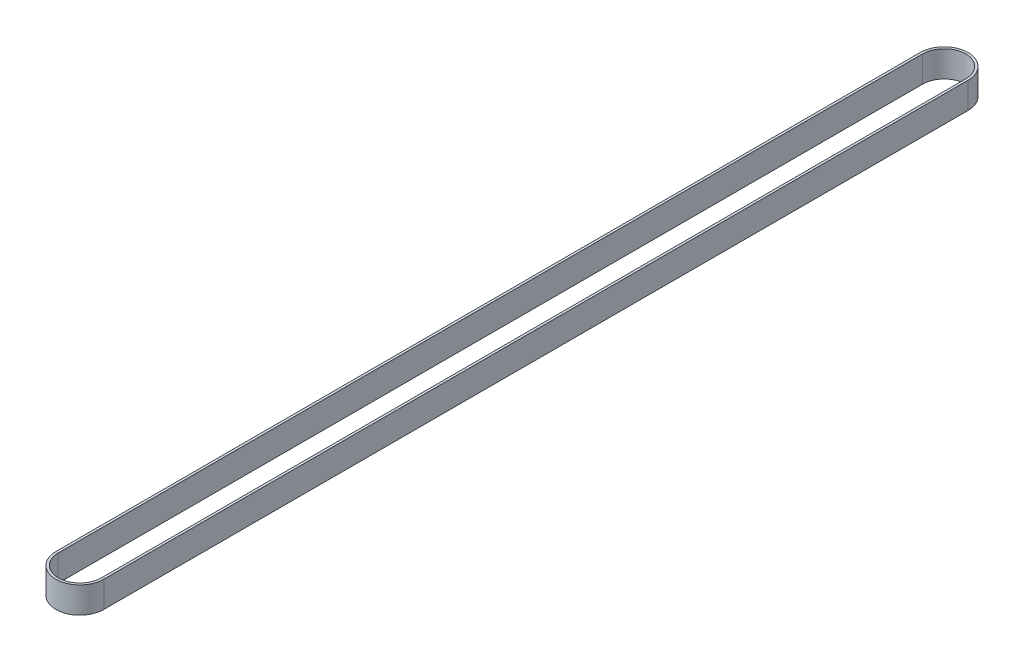
ISO-10303-21;
HEADER;
FILE_DESCRIPTION(('STEP AP214'),'2;1');
FILE_NAME('part.step','',(''),(''),'','','');
FILE_SCHEMA(('AUTOMOTIVE_DESIGN { 1 0 10303 214 1 1 1 1 }'));
ENDSEC;
DATA;
#1=APPLICATION_CONTEXT('core data for automotive mechanical design processes');
#2=APPLICATION_PROTOCOL_DEFINITION('international standard','automotive_design',2000,#1);
#3=PRODUCT_CONTEXT('',#1,'mechanical');
#4=PRODUCT('Part','Part','',(#3));
#5=PRODUCT_RELATED_PRODUCT_CATEGORY('part','',(#4));
#6=PRODUCT_DEFINITION_FORMATION('','',#4);
#7=PRODUCT_DEFINITION_CONTEXT('part definition',#1,'design');
#8=PRODUCT_DEFINITION('design','',#6,#7);
#9=PRODUCT_DEFINITION_SHAPE('','',#8);
#10=(LENGTH_UNIT() NAMED_UNIT(*) SI_UNIT(.MILLI.,.METRE.));
#11=(NAMED_UNIT(*) PLANE_ANGLE_UNIT() SI_UNIT($,.RADIAN.));
#12=(NAMED_UNIT(*) SI_UNIT($,.STERADIAN.) SOLID_ANGLE_UNIT());
#13=UNCERTAINTY_MEASURE_WITH_UNIT(LENGTH_MEASURE(1.E-05),#10,'distance_accuracy_value','');
#14=(GEOMETRIC_REPRESENTATION_CONTEXT(3) GLOBAL_UNCERTAINTY_ASSIGNED_CONTEXT((#13)) GLOBAL_UNIT_ASSIGNED_CONTEXT((#10,
#11,#12)) REPRESENTATION_CONTEXT('',''));
#15=CARTESIAN_POINT('',(0.,0.,0.));
#16=DIRECTION('',(0.,0.,1.));
#17=DIRECTION('',(1.,0.,0.));
#18=AXIS2_PLACEMENT_3D('',#15,#16,#17);
#19=CARTESIAN_POINT('',(0.,11.,0.));
#20=DIRECTION('',(0.,1.,0.));
#21=DIRECTION('',(0.,0.,1.));
#22=AXIS2_PLACEMENT_3D('',#19,#20,#21);
#23=PLANE('',#22);
#24=CARTESIAN_POINT('',(0.,11.,0.));
#25=DIRECTION('',(0.,1.,0.));
#26=DIRECTION('',(0.,0.,1.));
#27=AXIS2_PLACEMENT_3D('',#24,#25,#26);
#28=CIRCLE('',#27,10.05);
#29=CARTESIAN_POINT('',(10.0499999999966,11.,0.));
#30=VERTEX_POINT('',#29);
#31=CARTESIAN_POINT('',(-10.0500000000034,11.,0.));
#32=VERTEX_POINT('',#31);
#33=EDGE_CURVE('E133',#30,#32,#28,.T.);
#34=ORIENTED_EDGE('',*,*,#33,.T.);
#35=DIRECTION('',(0.,0.,1.));
#36=VECTOR('',#35,1.);
#37=CARTESIAN_POINT('',(-10.0500000000034,11.,0.));
#38=LINE('',#37,#36);
#39=CARTESIAN_POINT('',(-10.0500000000034,11.,362.5));
#40=VERTEX_POINT('',#39);
#41=EDGE_CURVE('E136',#32,#40,#38,.T.);
#42=ORIENTED_EDGE('',*,*,#41,.T.);
#43=CARTESIAN_POINT('',(-3.38444550163075E-12,11.,362.5));
#44=DIRECTION('',(0.,1.,0.));
#45=DIRECTION('',(0.,0.,1.));
#46=AXIS2_PLACEMENT_3D('',#43,#44,#45);
#47=CIRCLE('',#46,10.05);
#48=CARTESIAN_POINT('',(10.0499999999966,11.,362.5));
#49=VERTEX_POINT('',#48);
#50=EDGE_CURVE('E139',#40,#49,#47,.T.);
#51=ORIENTED_EDGE('',*,*,#50,.T.);
#52=DIRECTION('',(0.,0.,-1.));
#53=VECTOR('',#52,1.);
#54=CARTESIAN_POINT('',(10.0499999999966,11.,362.5));
#55=LINE('',#54,#53);
#56=EDGE_CURVE('E141',#49,#30,#55,.T.);
#57=ORIENTED_EDGE('',*,*,#56,.T.);
#58=EDGE_LOOP('',(#34,#42,#51,#57));
#59=FACE_BOUND('',#58,.T.);
#60=DIRECTION('',(0.,0.,1.));
#61=VECTOR('',#60,1.);
#62=CARTESIAN_POINT('',(-9.05000000000339,11.,0.));
#63=LINE('',#62,#61);
#64=CARTESIAN_POINT('',(-9.05000000000339,11.,0.));
#65=VERTEX_POINT('',#64);
#66=CARTESIAN_POINT('',(-9.05000000000334,11.,362.5));
#67=VERTEX_POINT('',#66);
#68=EDGE_CURVE('E105',#65,#67,#63,.T.);
#69=ORIENTED_EDGE('',*,*,#68,.F.);
#70=CARTESIAN_POINT('',(0.,11.,0.));
#71=DIRECTION('',(0.,1.,0.));
#72=DIRECTION('',(0.,0.,1.));
#73=AXIS2_PLACEMENT_3D('',#70,#71,#72);
#74=CIRCLE('',#73,9.04999999999998);
#75=CARTESIAN_POINT('',(9.04999999999658,11.,0.));
#76=VERTEX_POINT('',#75);
#77=EDGE_CURVE('E97',#76,#65,#74,.T.);
#78=ORIENTED_EDGE('',*,*,#77,.F.);
#79=DIRECTION('',(0.,0.,-1.));
#80=VECTOR('',#79,1.);
#81=CARTESIAN_POINT('',(9.04999999999657,11.,362.5));
#82=LINE('',#81,#80);
#83=CARTESIAN_POINT('',(9.04999999999657,11.,362.5));
#84=VERTEX_POINT('',#83);
#85=EDGE_CURVE('E119',#84,#76,#82,.T.);
#86=ORIENTED_EDGE('',*,*,#85,.F.);
#87=CARTESIAN_POINT('',(-3.38444550163075E-12,11.,362.5));
#88=DIRECTION('',(0.,1.,0.));
#89=DIRECTION('',(0.,0.,1.));
#90=AXIS2_PLACEMENT_3D('',#87,#88,#89);
#91=CIRCLE('',#90,9.04999999999996);
#92=EDGE_CURVE('E117',#67,#84,#91,.T.);
#93=ORIENTED_EDGE('',*,*,#92,.F.);
#94=EDGE_LOOP('',(#69,#78,#86,#93));
#95=FACE_BOUND('',#94,.T.);
#96=ADVANCED_FACE('F32',(#59,#95),#23,.T.);
#97=CARTESIAN_POINT('',(0.,0.,0.));
#98=DIRECTION('',(0.,1.,0.));
#99=DIRECTION('',(0.,0.,1.));
#100=AXIS2_PLACEMENT_3D('',#97,#98,#99);
#101=PLANE('',#100);
#102=CARTESIAN_POINT('',(0.,0.,0.));
#103=DIRECTION('',(0.,1.,0.));
#104=DIRECTION('',(0.,0.,1.));
#105=AXIS2_PLACEMENT_3D('',#102,#103,#104);
#106=CIRCLE('',#105,10.05);
#107=CARTESIAN_POINT('',(10.0499999999966,0.,0.));
#108=VERTEX_POINT('',#107);
#109=CARTESIAN_POINT('',(-10.0500000000034,0.,0.));
#110=VERTEX_POINT('',#109);
#111=EDGE_CURVE('E113',#108,#110,#106,.T.);
#112=ORIENTED_EDGE('',*,*,#111,.F.);
#113=DIRECTION('',(0.,0.,-1.));
#114=VECTOR('',#113,1.);
#115=CARTESIAN_POINT('',(10.0499999999966,0.,362.5));
#116=LINE('',#115,#114);
#117=CARTESIAN_POINT('',(10.0499999999966,0.,362.5));
#118=VERTEX_POINT('',#117);
#119=EDGE_CURVE('E137',#118,#108,#116,.T.);
#120=ORIENTED_EDGE('',*,*,#119,.F.);
#121=CARTESIAN_POINT('',(-3.38444550163075E-12,0.,362.5));
#122=DIRECTION('',(0.,1.,0.));
#123=DIRECTION('',(0.,0.,1.));
#124=AXIS2_PLACEMENT_3D('',#121,#122,#123);
#125=CIRCLE('',#124,10.05);
#126=CARTESIAN_POINT('',(-10.0500000000034,0.,362.5));
#127=VERTEX_POINT('',#126);
#128=EDGE_CURVE('E148',#127,#118,#125,.T.);
#129=ORIENTED_EDGE('',*,*,#128,.F.);
#130=DIRECTION('',(0.,0.,1.));
#131=VECTOR('',#130,1.);
#132=CARTESIAN_POINT('',(-10.0500000000034,0.,0.));
#133=LINE('',#132,#131);
#134=EDGE_CURVE('E146',#110,#127,#133,.T.);
#135=ORIENTED_EDGE('',*,*,#134,.F.);
#136=EDGE_LOOP('',(#112,#120,#129,#135));
#137=FACE_BOUND('',#136,.T.);
#138=CARTESIAN_POINT('',(0.,0.,0.));
#139=DIRECTION('',(0.,1.,0.));
#140=DIRECTION('',(0.,0.,1.));
#141=AXIS2_PLACEMENT_3D('',#138,#139,#140);
#142=CIRCLE('',#141,9.04999999999998);
#143=CARTESIAN_POINT('',(9.04999999999658,0.,0.));
#144=VERTEX_POINT('',#143);
#145=CARTESIAN_POINT('',(-9.05000000000339,0.,0.));
#146=VERTEX_POINT('',#145);
#147=EDGE_CURVE('E55',#144,#146,#142,.T.);
#148=ORIENTED_EDGE('',*,*,#147,.T.);
#149=DIRECTION('',(0.,0.,1.));
#150=VECTOR('',#149,1.);
#151=CARTESIAN_POINT('',(-9.05000000000339,0.,0.));
#152=LINE('',#151,#150);
#153=CARTESIAN_POINT('',(-9.05000000000334,0.,362.5));
#154=VERTEX_POINT('',#153);
#155=EDGE_CURVE('E112',#146,#154,#152,.T.);
#156=ORIENTED_EDGE('',*,*,#155,.T.);
#157=CARTESIAN_POINT('',(-3.38444550163075E-12,0.,362.5));
#158=DIRECTION('',(0.,1.,0.));
#159=DIRECTION('',(0.,0.,1.));
#160=AXIS2_PLACEMENT_3D('',#157,#158,#159);
#161=CIRCLE('',#160,9.04999999999996);
#162=CARTESIAN_POINT('',(9.04999999999657,0.,362.5));
#163=VERTEX_POINT('',#162);
#164=EDGE_CURVE('E125',#154,#163,#161,.T.);
#165=ORIENTED_EDGE('',*,*,#164,.T.);
#166=DIRECTION('',(0.,0.,-1.));
#167=VECTOR('',#166,1.);
#168=CARTESIAN_POINT('',(9.04999999999657,0.,362.5));
#169=LINE('',#168,#167);
#170=EDGE_CURVE('E106',#163,#144,#169,.T.);
#171=ORIENTED_EDGE('',*,*,#170,.T.);
#172=EDGE_LOOP('',(#148,#156,#165,#171));
#173=FACE_BOUND('',#172,.T.);
#174=ADVANCED_FACE('F166',(#137,#173),#101,.F.);
#175=CARTESIAN_POINT('',(0.,11.,0.));
#176=DIRECTION('',(0.,-1.,0.));
#177=DIRECTION('',(0.,0.,-1.));
#178=AXIS2_PLACEMENT_3D('',#175,#176,#177);
#179=CYLINDRICAL_SURFACE('',#178,10.05);
#180=ORIENTED_EDGE('',*,*,#111,.T.);
#181=DIRECTION('',(0.,-1.,0.));
#182=VECTOR('',#181,1.);
#183=CARTESIAN_POINT('',(-10.0500000000034,11.,0.));
#184=LINE('',#183,#182);
#185=EDGE_CURVE('E11',#32,#110,#184,.T.);
#186=ORIENTED_EDGE('',*,*,#185,.F.);
#187=ORIENTED_EDGE('',*,*,#33,.F.);
#188=DIRECTION('',(0.,-1.,0.));
#189=VECTOR('',#188,1.);
#190=CARTESIAN_POINT('',(10.0499999999966,11.,0.));
#191=LINE('',#190,#189);
#192=EDGE_CURVE('E143',#30,#108,#191,.T.);
#193=ORIENTED_EDGE('',*,*,#192,.T.);
#194=EDGE_LOOP('',(#180,#186,#187,#193));
#195=FACE_BOUND('',#194,.T.);
#196=ADVANCED_FACE('F34',(#195),#179,.T.);
#197=CARTESIAN_POINT('',(-10.0500000000034,11.,0.));
#198=DIRECTION('',(1.,0.,0.));
#199=DIRECTION('',(0.,0.,-1.));
#200=AXIS2_PLACEMENT_3D('',#197,#198,#199);
#201=PLANE('',#200);
#202=ORIENTED_EDGE('',*,*,#134,.T.);
#203=DIRECTION('',(0.,-1.,0.));
#204=VECTOR('',#203,1.);
#205=CARTESIAN_POINT('',(-10.0500000000034,11.,362.5));
#206=LINE('',#205,#204);
#207=EDGE_CURVE('E40',#40,#127,#206,.T.);
#208=ORIENTED_EDGE('',*,*,#207,.F.);
#209=ORIENTED_EDGE('',*,*,#41,.F.);
#210=ORIENTED_EDGE('',*,*,#185,.T.);
#211=EDGE_LOOP('',(#202,#208,#209,#210));
#212=FACE_BOUND('',#211,.T.);
#213=ADVANCED_FACE('F176',(#212),#201,.F.);
#214=CARTESIAN_POINT('',(-3.38444550163075E-12,11.,362.5));
#215=DIRECTION('',(0.,-1.,0.));
#216=DIRECTION('',(0.,0.,-1.));
#217=AXIS2_PLACEMENT_3D('',#214,#215,#216);
#218=CYLINDRICAL_SURFACE('',#217,10.05);
#219=ORIENTED_EDGE('',*,*,#128,.T.);
#220=DIRECTION('',(0.,-1.,0.));
#221=VECTOR('',#220,1.);
#222=CARTESIAN_POINT('',(10.0499999999966,11.,362.5));
#223=LINE('',#222,#221);
#224=EDGE_CURVE('E153',#49,#118,#223,.T.);
#225=ORIENTED_EDGE('',*,*,#224,.F.);
#226=ORIENTED_EDGE('',*,*,#50,.F.);
#227=ORIENTED_EDGE('',*,*,#207,.T.);
#228=EDGE_LOOP('',(#219,#225,#226,#227));
#229=FACE_BOUND('',#228,.T.);
#230=ADVANCED_FACE('F160',(#229),#218,.T.);
#231=CARTESIAN_POINT('',(10.0499999999966,11.,362.5));
#232=DIRECTION('',(-1.,0.,0.));
#233=DIRECTION('',(0.,0.,1.));
#234=AXIS2_PLACEMENT_3D('',#231,#232,#233);
#235=PLANE('',#234);
#236=ORIENTED_EDGE('',*,*,#119,.T.);
#237=ORIENTED_EDGE('',*,*,#192,.F.);
#238=ORIENTED_EDGE('',*,*,#56,.F.);
#239=ORIENTED_EDGE('',*,*,#224,.T.);
#240=EDGE_LOOP('',(#236,#237,#238,#239));
#241=FACE_BOUND('',#240,.T.);
#242=ADVANCED_FACE('F170',(#241),#235,.F.);
#243=CARTESIAN_POINT('',(0.,11.,0.));
#244=DIRECTION('',(0.,-1.,0.));
#245=DIRECTION('',(0.,0.,-1.));
#246=AXIS2_PLACEMENT_3D('',#243,#244,#245);
#247=CYLINDRICAL_SURFACE('',#246,9.04999999999998);
#248=ORIENTED_EDGE('',*,*,#147,.F.);
#249=DIRECTION('',(0.,-1.,0.));
#250=VECTOR('',#249,1.);
#251=CARTESIAN_POINT('',(9.04999999999658,11.,0.));
#252=LINE('',#251,#250);
#253=EDGE_CURVE('E101',#76,#144,#252,.T.);
#254=ORIENTED_EDGE('',*,*,#253,.F.);
#255=ORIENTED_EDGE('',*,*,#77,.T.);
#256=DIRECTION('',(0.,-1.,0.));
#257=VECTOR('',#256,1.);
#258=CARTESIAN_POINT('',(-9.05000000000339,11.,0.));
#259=LINE('',#258,#257);
#260=EDGE_CURVE('E100',#65,#146,#259,.T.);
#261=ORIENTED_EDGE('',*,*,#260,.T.);
#262=EDGE_LOOP('',(#248,#254,#255,#261));
#263=FACE_BOUND('',#262,.T.);
#264=ADVANCED_FACE('F99',(#263),#247,.F.);
#265=CARTESIAN_POINT('',(-9.05000000000339,11.,0.));
#266=DIRECTION('',(1.,0.,0.));
#267=DIRECTION('',(0.,0.,-1.));
#268=AXIS2_PLACEMENT_3D('',#265,#266,#267);
#269=PLANE('',#268);
#270=ORIENTED_EDGE('',*,*,#155,.F.);
#271=ORIENTED_EDGE('',*,*,#260,.F.);
#272=ORIENTED_EDGE('',*,*,#68,.T.);
#273=DIRECTION('',(0.,-1.,0.));
#274=VECTOR('',#273,1.);
#275=CARTESIAN_POINT('',(-9.05000000000334,11.,362.5));
#276=LINE('',#275,#274);
#277=EDGE_CURVE('E114',#67,#154,#276,.T.);
#278=ORIENTED_EDGE('',*,*,#277,.T.);
#279=EDGE_LOOP('',(#270,#271,#272,#278));
#280=FACE_BOUND('',#279,.T.);
#281=ADVANCED_FACE('F109',(#280),#269,.T.);
#282=CARTESIAN_POINT('',(-3.38444550163075E-12,11.,362.5));
#283=DIRECTION('',(0.,-1.,0.));
#284=DIRECTION('',(0.,0.,-1.));
#285=AXIS2_PLACEMENT_3D('',#282,#283,#284);
#286=CYLINDRICAL_SURFACE('',#285,9.04999999999996);
#287=ORIENTED_EDGE('',*,*,#164,.F.);
#288=ORIENTED_EDGE('',*,*,#277,.F.);
#289=ORIENTED_EDGE('',*,*,#92,.T.);
#290=DIRECTION('',(0.,-1.,0.));
#291=VECTOR('',#290,1.);
#292=CARTESIAN_POINT('',(9.04999999999657,11.,362.5));
#293=LINE('',#292,#291);
#294=EDGE_CURVE('E47',#84,#163,#293,.T.);
#295=ORIENTED_EDGE('',*,*,#294,.T.);
#296=EDGE_LOOP('',(#287,#288,#289,#295));
#297=FACE_BOUND('',#296,.T.);
#298=ADVANCED_FACE('F199',(#297),#286,.F.);
#299=CARTESIAN_POINT('',(9.04999999999657,11.,362.5));
#300=DIRECTION('',(-1.,0.,0.));
#301=DIRECTION('',(0.,0.,1.));
#302=AXIS2_PLACEMENT_3D('',#299,#300,#301);
#303=PLANE('',#302);
#304=ORIENTED_EDGE('',*,*,#170,.F.);
#305=ORIENTED_EDGE('',*,*,#294,.F.);
#306=ORIENTED_EDGE('',*,*,#85,.T.);
#307=ORIENTED_EDGE('',*,*,#253,.T.);
#308=EDGE_LOOP('',(#304,#305,#306,#307));
#309=FACE_BOUND('',#308,.T.);
#310=ADVANCED_FACE('F203',(#309),#303,.T.);
#311=CLOSED_SHELL('',(#96,#174,#196,#213,#230,#242,#264,#281,#298,#310));
#312=MANIFOLD_SOLID_BREP('B2',#311);
#313=ADVANCED_BREP_SHAPE_REPRESENTATION('',(#18,#312),#14);
#314=SHAPE_DEFINITION_REPRESENTATION(#9,#313);
ENDSEC;
END-ISO-10303-21;
